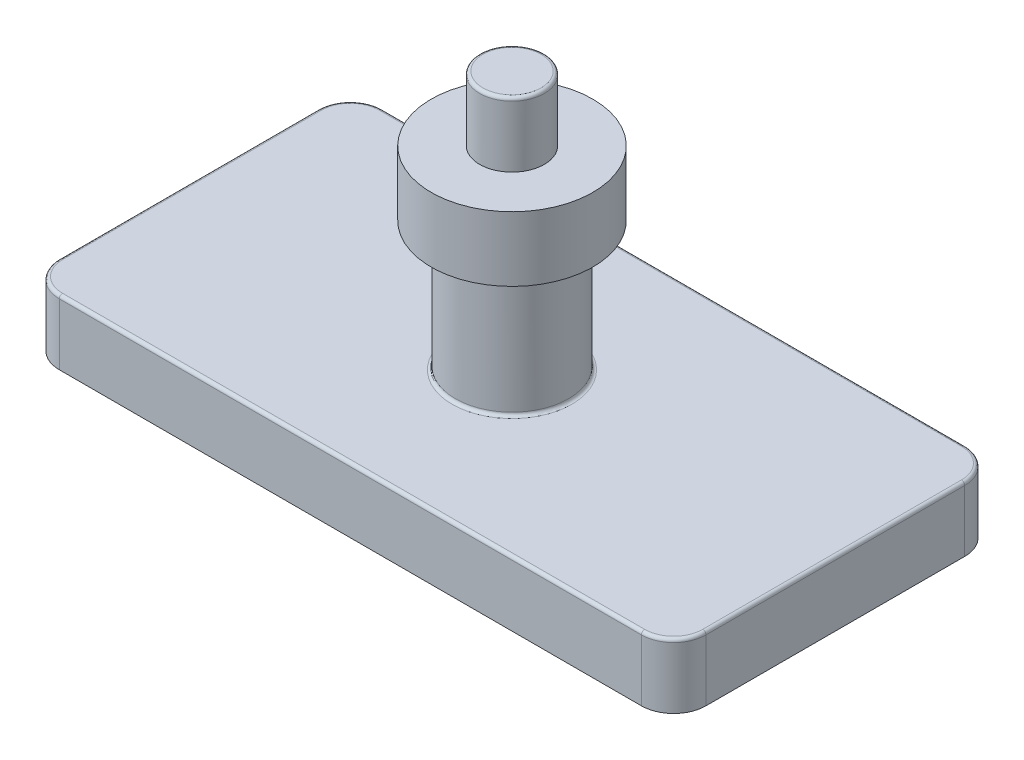
ISO-10303-21;
HEADER;
FILE_DESCRIPTION(('STEP AP214'),'2;1');
FILE_NAME('part.step','',(''),(''),'','','');
FILE_SCHEMA(('AUTOMOTIVE_DESIGN { 1 0 10303 214 1 1 1 1 }'));
ENDSEC;
DATA;
#1=APPLICATION_CONTEXT('core data for automotive mechanical design processes');
#2=APPLICATION_PROTOCOL_DEFINITION('international standard','automotive_design',2000,#1);
#3=PRODUCT_CONTEXT('',#1,'mechanical');
#4=PRODUCT('Part','Part','',(#3));
#5=PRODUCT_RELATED_PRODUCT_CATEGORY('part','',(#4));
#6=PRODUCT_DEFINITION_FORMATION('','',#4);
#7=PRODUCT_DEFINITION_CONTEXT('part definition',#1,'design');
#8=PRODUCT_DEFINITION('design','',#6,#7);
#9=PRODUCT_DEFINITION_SHAPE('','',#8);
#10=(LENGTH_UNIT() NAMED_UNIT(*) SI_UNIT(.MILLI.,.METRE.));
#11=(NAMED_UNIT(*) PLANE_ANGLE_UNIT() SI_UNIT($,.RADIAN.));
#12=(NAMED_UNIT(*) SI_UNIT($,.STERADIAN.) SOLID_ANGLE_UNIT());
#13=UNCERTAINTY_MEASURE_WITH_UNIT(LENGTH_MEASURE(1.E-05),#10,'distance_accuracy_value','');
#14=(GEOMETRIC_REPRESENTATION_CONTEXT(3) GLOBAL_UNCERTAINTY_ASSIGNED_CONTEXT((#13)) GLOBAL_UNIT_ASSIGNED_CONTEXT((#10,
#11,#12)) REPRESENTATION_CONTEXT('',''));
#15=CARTESIAN_POINT('',(0.,0.,0.));
#16=DIRECTION('',(0.,0.,1.));
#17=DIRECTION('',(1.,0.,0.));
#18=AXIS2_PLACEMENT_3D('',#15,#16,#17);
#19=CARTESIAN_POINT('',(-127.,25.4,-63.5));
#20=DIRECTION('',(1.,0.,0.));
#21=DIRECTION('',(0.,0.,-1.));
#22=AXIS2_PLACEMENT_3D('',#19,#20,#21);
#23=PLANE('',#22);
#24=DIRECTION('',(0.,-1.,0.));
#25=VECTOR('',#24,1.);
#26=CARTESIAN_POINT('',(-127.,25.4,50.8));
#27=LINE('',#26,#25);
#28=CARTESIAN_POINT('',(-127.,0.,50.8));
#29=VERTEX_POINT('',#28);
#30=CARTESIAN_POINT('',(-127.,24.13,50.8));
#31=VERTEX_POINT('',#30);
#32=EDGE_CURVE('E165',#29,#31,#27,.F.);
#33=ORIENTED_EDGE('',*,*,#32,.T.);
#34=DIRECTION('',(0.,0.,1.));
#35=VECTOR('',#34,1.);
#36=CARTESIAN_POINT('',(-127.,24.13,-50.8));
#37=LINE('',#36,#35);
#38=CARTESIAN_POINT('',(-127.,24.13,-50.8));
#39=VERTEX_POINT('',#38);
#40=EDGE_CURVE('E193',#31,#39,#37,.F.);
#41=ORIENTED_EDGE('',*,*,#40,.T.);
#42=DIRECTION('',(0.,-1.,0.));
#43=VECTOR('',#42,1.);
#44=CARTESIAN_POINT('',(-127.,25.4,-50.8));
#45=LINE('',#44,#43);
#46=CARTESIAN_POINT('',(-127.,0.,-50.8));
#47=VERTEX_POINT('',#46);
#48=EDGE_CURVE('E168',#39,#47,#45,.T.);
#49=ORIENTED_EDGE('',*,*,#48,.T.);
#50=DIRECTION('',(0.,0.,1.));
#51=VECTOR('',#50,1.);
#52=CARTESIAN_POINT('',(-127.,0.,-63.5));
#53=LINE('',#52,#51);
#54=EDGE_CURVE('E149',#47,#29,#53,.T.);
#55=ORIENTED_EDGE('',*,*,#54,.T.);
#56=EDGE_LOOP('',(#33,#41,#49,#55));
#57=FACE_BOUND('',#56,.T.);
#58=ADVANCED_FACE('F34',(#57),#23,.F.);
#59=CARTESIAN_POINT('',(-127.,25.4,63.5));
#60=DIRECTION('',(0.,0.,-1.));
#61=DIRECTION('',(-1.,0.,0.));
#62=AXIS2_PLACEMENT_3D('',#59,#60,#61);
#63=PLANE('',#62);
#64=DIRECTION('',(0.,-1.,0.));
#65=VECTOR('',#64,1.);
#66=CARTESIAN_POINT('',(114.3,25.4,63.5));
#67=LINE('',#66,#65);
#68=CARTESIAN_POINT('',(114.3,0.,63.5));
#69=VERTEX_POINT('',#68);
#70=CARTESIAN_POINT('',(114.3,24.13,63.5));
#71=VERTEX_POINT('',#70);
#72=EDGE_CURVE('E134',#69,#71,#67,.F.);
#73=ORIENTED_EDGE('',*,*,#72,.T.);
#74=DIRECTION('',(1.,0.,0.));
#75=VECTOR('',#74,1.);
#76=CARTESIAN_POINT('',(-114.3,24.13,63.5));
#77=LINE('',#76,#75);
#78=CARTESIAN_POINT('',(-114.3,24.13,63.5));
#79=VERTEX_POINT('',#78);
#80=EDGE_CURVE('E206',#71,#79,#77,.F.);
#81=ORIENTED_EDGE('',*,*,#80,.T.);
#82=DIRECTION('',(0.,-1.,0.));
#83=VECTOR('',#82,1.);
#84=CARTESIAN_POINT('',(-114.3,25.4,63.5));
#85=LINE('',#84,#83);
#86=CARTESIAN_POINT('',(-114.3,0.,63.5));
#87=VERTEX_POINT('',#86);
#88=EDGE_CURVE('E138',#79,#87,#85,.T.);
#89=ORIENTED_EDGE('',*,*,#88,.T.);
#90=DIRECTION('',(1.,0.,0.));
#91=VECTOR('',#90,1.);
#92=CARTESIAN_POINT('',(-127.,0.,63.5));
#93=LINE('',#92,#91);
#94=EDGE_CURVE('E145',#87,#69,#93,.T.);
#95=ORIENTED_EDGE('',*,*,#94,.T.);
#96=EDGE_LOOP('',(#73,#81,#89,#95));
#97=FACE_BOUND('',#96,.T.);
#98=ADVANCED_FACE('F226',(#97),#63,.F.);
#99=CARTESIAN_POINT('',(127.,25.4,-63.5));
#100=DIRECTION('',(-1.,0.,0.));
#101=DIRECTION('',(0.,0.,1.));
#102=AXIS2_PLACEMENT_3D('',#99,#100,#101);
#103=PLANE('',#102);
#104=DIRECTION('',(0.,-1.,0.));
#105=VECTOR('',#104,1.);
#106=CARTESIAN_POINT('',(127.,25.4,-50.8));
#107=LINE('',#106,#105);
#108=CARTESIAN_POINT('',(127.,0.,-50.8));
#109=VERTEX_POINT('',#108);
#110=CARTESIAN_POINT('',(127.,24.13,-50.8));
#111=VERTEX_POINT('',#110);
#112=EDGE_CURVE('E130',#109,#111,#107,.F.);
#113=ORIENTED_EDGE('',*,*,#112,.T.);
#114=DIRECTION('',(0.,0.,-1.));
#115=VECTOR('',#114,1.);
#116=CARTESIAN_POINT('',(127.,24.13,50.8));
#117=LINE('',#116,#115);
#118=CARTESIAN_POINT('',(127.,24.13,50.8));
#119=VERTEX_POINT('',#118);
#120=EDGE_CURVE('E56',#111,#119,#117,.F.);
#121=ORIENTED_EDGE('',*,*,#120,.T.);
#122=DIRECTION('',(0.,-1.,0.));
#123=VECTOR('',#122,1.);
#124=CARTESIAN_POINT('',(127.,25.4,50.8));
#125=LINE('',#124,#123);
#126=CARTESIAN_POINT('',(127.,0.,50.8));
#127=VERTEX_POINT('',#126);
#128=EDGE_CURVE('E122',#119,#127,#125,.T.);
#129=ORIENTED_EDGE('',*,*,#128,.T.);
#130=DIRECTION('',(0.,0.,-1.));
#131=VECTOR('',#130,1.);
#132=CARTESIAN_POINT('',(127.,0.,-63.5));
#133=LINE('',#132,#131);
#134=EDGE_CURVE('E126',#127,#109,#133,.T.);
#135=ORIENTED_EDGE('',*,*,#134,.T.);
#136=EDGE_LOOP('',(#113,#121,#129,#135));
#137=FACE_BOUND('',#136,.T.);
#138=ADVANCED_FACE('F124',(#137),#103,.F.);
#139=CARTESIAN_POINT('',(-127.,25.4,-63.5));
#140=DIRECTION('',(0.,0.,1.));
#141=DIRECTION('',(1.,0.,0.));
#142=AXIS2_PLACEMENT_3D('',#139,#140,#141);
#143=PLANE('',#142);
#144=DIRECTION('',(0.,-1.,0.));
#145=VECTOR('',#144,1.);
#146=CARTESIAN_POINT('',(-114.3,25.4,-63.5));
#147=LINE('',#146,#145);
#148=CARTESIAN_POINT('',(-114.3,0.,-63.5));
#149=VERTEX_POINT('',#148);
#150=CARTESIAN_POINT('',(-114.3,24.13,-63.5));
#151=VERTEX_POINT('',#150);
#152=EDGE_CURVE('E160',#149,#151,#147,.F.);
#153=ORIENTED_EDGE('',*,*,#152,.T.);
#154=DIRECTION('',(-1.,0.,0.));
#155=VECTOR('',#154,1.);
#156=CARTESIAN_POINT('',(114.3,24.13,-63.5));
#157=LINE('',#156,#155);
#158=CARTESIAN_POINT('',(114.3,24.13,-63.5));
#159=VERTEX_POINT('',#158);
#160=EDGE_CURVE('E197',#151,#159,#157,.F.);
#161=ORIENTED_EDGE('',*,*,#160,.T.);
#162=DIRECTION('',(0.,-1.,0.));
#163=VECTOR('',#162,1.);
#164=CARTESIAN_POINT('',(114.3,25.4,-63.5));
#165=LINE('',#164,#163);
#166=CARTESIAN_POINT('',(114.3,0.,-63.5));
#167=VERTEX_POINT('',#166);
#168=EDGE_CURVE('E163',#159,#167,#165,.T.);
#169=ORIENTED_EDGE('',*,*,#168,.T.);
#170=DIRECTION('',(-1.,0.,0.));
#171=VECTOR('',#170,1.);
#172=CARTESIAN_POINT('',(-127.,0.,-63.5));
#173=LINE('',#172,#171);
#174=EDGE_CURVE('E144',#167,#149,#173,.T.);
#175=ORIENTED_EDGE('',*,*,#174,.T.);
#176=EDGE_LOOP('',(#153,#161,#169,#175));
#177=FACE_BOUND('',#176,.T.);
#178=ADVANCED_FACE('F306',(#177),#143,.F.);
#179=CARTESIAN_POINT('',(-127.,25.4,63.5));
#180=DIRECTION('',(0.,1.,0.));
#181=DIRECTION('',(0.,0.,1.));
#182=AXIS2_PLACEMENT_3D('',#179,#180,#181);
#183=PLANE('',#182);
#184=CARTESIAN_POINT('',(0.,25.4,0.));
#185=DIRECTION('',(0.,1.,0.));
#186=DIRECTION('',(0.,0.,1.));
#187=AXIS2_PLACEMENT_3D('',#184,#185,#186);
#188=CIRCLE('',#187,23.495);
#189=CARTESIAN_POINT('',(0.,25.4,23.495));
#190=VERTEX_POINT('',#189);
#191=EDGE_CURVE('E187',#190,#190,#188,.F.);
#192=ORIENTED_EDGE('',*,*,#191,.T.);
#193=EDGE_LOOP('',(#192));
#194=FACE_BOUND('',#193,.T.);
#195=DIRECTION('',(0.,0.,1.));
#196=VECTOR('',#195,1.);
#197=CARTESIAN_POINT('',(-125.73,25.4,50.8));
#198=LINE('',#197,#196);
#199=CARTESIAN_POINT('',(-125.73,25.4,-50.8));
#200=VERTEX_POINT('',#199);
#201=CARTESIAN_POINT('',(-125.73,25.4,50.8));
#202=VERTEX_POINT('',#201);
#203=EDGE_CURVE('E182',#200,#202,#198,.T.);
#204=ORIENTED_EDGE('',*,*,#203,.T.);
#205=CARTESIAN_POINT('',(-114.3,25.4,50.8));
#206=DIRECTION('',(0.,1.,0.));
#207=DIRECTION('',(0.,0.,1.));
#208=AXIS2_PLACEMENT_3D('',#205,#206,#207);
#209=CIRCLE('',#208,11.43);
#210=CARTESIAN_POINT('',(-114.3,25.4,62.23));
#211=VERTEX_POINT('',#210);
#212=EDGE_CURVE('E184',#202,#211,#209,.T.);
#213=ORIENTED_EDGE('',*,*,#212,.T.);
#214=DIRECTION('',(1.,0.,0.));
#215=VECTOR('',#214,1.);
#216=CARTESIAN_POINT('',(114.3,25.4,62.23));
#217=LINE('',#216,#215);
#218=CARTESIAN_POINT('',(114.3,25.4,62.23));
#219=VERTEX_POINT('',#218);
#220=EDGE_CURVE('E170',#211,#219,#217,.T.);
#221=ORIENTED_EDGE('',*,*,#220,.T.);
#222=CARTESIAN_POINT('',(114.3,25.4,50.8));
#223=DIRECTION('',(0.,1.,0.));
#224=DIRECTION('',(0.,0.,1.));
#225=AXIS2_PLACEMENT_3D('',#222,#223,#224);
#226=CIRCLE('',#225,11.43);
#227=CARTESIAN_POINT('',(125.73,25.4,50.8));
#228=VERTEX_POINT('',#227);
#229=EDGE_CURVE('E172',#219,#228,#226,.T.);
#230=ORIENTED_EDGE('',*,*,#229,.T.);
#231=DIRECTION('',(0.,0.,-1.));
#232=VECTOR('',#231,1.);
#233=CARTESIAN_POINT('',(125.73,25.4,-50.8));
#234=LINE('',#233,#232);
#235=CARTESIAN_POINT('',(125.73,25.4,-50.8));
#236=VERTEX_POINT('',#235);
#237=EDGE_CURVE('E174',#228,#236,#234,.T.);
#238=ORIENTED_EDGE('',*,*,#237,.T.);
#239=CARTESIAN_POINT('',(114.3,25.4,-50.8));
#240=DIRECTION('',(0.,1.,0.));
#241=DIRECTION('',(0.,0.,1.));
#242=AXIS2_PLACEMENT_3D('',#239,#240,#241);
#243=CIRCLE('',#242,11.43);
#244=CARTESIAN_POINT('',(114.3,25.4,-62.23));
#245=VERTEX_POINT('',#244);
#246=EDGE_CURVE('E176',#236,#245,#243,.T.);
#247=ORIENTED_EDGE('',*,*,#246,.T.);
#248=DIRECTION('',(-1.,0.,0.));
#249=VECTOR('',#248,1.);
#250=CARTESIAN_POINT('',(-114.3,25.4,-62.23));
#251=LINE('',#250,#249);
#252=CARTESIAN_POINT('',(-114.3,25.4,-62.23));
#253=VERTEX_POINT('',#252);
#254=EDGE_CURVE('E178',#245,#253,#251,.T.);
#255=ORIENTED_EDGE('',*,*,#254,.T.);
#256=CARTESIAN_POINT('',(-114.3,25.4,-50.8));
#257=DIRECTION('',(0.,1.,0.));
#258=DIRECTION('',(0.,0.,1.));
#259=AXIS2_PLACEMENT_3D('',#256,#257,#258);
#260=CIRCLE('',#259,11.43);
#261=EDGE_CURVE('E180',#253,#200,#260,.T.);
#262=ORIENTED_EDGE('',*,*,#261,.T.);
#263=EDGE_LOOP('',(#204,#213,#221,#230,#238,#247,#255,#262));
#264=FACE_BOUND('',#263,.T.);
#265=ADVANCED_FACE('F303',(#194,#264),#183,.T.);
#266=CARTESIAN_POINT('',(-127.,0.,63.5));
#267=DIRECTION('',(0.,1.,0.));
#268=DIRECTION('',(0.,0.,1.));
#269=AXIS2_PLACEMENT_3D('',#266,#267,#268);
#270=PLANE('',#269);
#271=ORIENTED_EDGE('',*,*,#134,.F.);
#272=CARTESIAN_POINT('',(114.3,0.,50.8));
#273=DIRECTION('',(0.,1.,0.));
#274=DIRECTION('',(0.,0.,1.));
#275=AXIS2_PLACEMENT_3D('',#272,#273,#274);
#276=CIRCLE('',#275,12.7);
#277=EDGE_CURVE('E132',#127,#69,#276,.F.);
#278=ORIENTED_EDGE('',*,*,#277,.T.);
#279=ORIENTED_EDGE('',*,*,#94,.F.);
#280=CARTESIAN_POINT('',(-114.3,0.,50.8));
#281=DIRECTION('',(0.,1.,0.));
#282=DIRECTION('',(0.,0.,1.));
#283=AXIS2_PLACEMENT_3D('',#280,#281,#282);
#284=CIRCLE('',#283,12.7);
#285=EDGE_CURVE('E129',#87,#29,#284,.F.);
#286=ORIENTED_EDGE('',*,*,#285,.T.);
#287=ORIENTED_EDGE('',*,*,#54,.F.);
#288=CARTESIAN_POINT('',(-114.3,0.,-50.8));
#289=DIRECTION('',(0.,1.,0.));
#290=DIRECTION('',(0.,0.,1.));
#291=AXIS2_PLACEMENT_3D('',#288,#289,#290);
#292=CIRCLE('',#291,12.7);
#293=EDGE_CURVE('E155',#47,#149,#292,.F.);
#294=ORIENTED_EDGE('',*,*,#293,.T.);
#295=ORIENTED_EDGE('',*,*,#174,.F.);
#296=CARTESIAN_POINT('',(114.3,0.,-50.8));
#297=DIRECTION('',(0.,1.,0.));
#298=DIRECTION('',(0.,0.,1.));
#299=AXIS2_PLACEMENT_3D('',#296,#297,#298);
#300=CIRCLE('',#299,12.7);
#301=EDGE_CURVE('E139',#167,#109,#300,.F.);
#302=ORIENTED_EDGE('',*,*,#301,.T.);
#303=EDGE_LOOP('',(#271,#278,#279,#286,#287,#294,#295,#302));
#304=FACE_BOUND('',#303,.T.);
#305=ADVANCED_FACE('F141',(#304),#270,.F.);
#306=CARTESIAN_POINT('',(0.,127.,0.));
#307=DIRECTION('',(0.,1.,0.));
#308=DIRECTION('',(0.,0.,1.));
#309=AXIS2_PLACEMENT_3D('',#306,#307,#308);
#310=PLANE('',#309);
#311=CARTESIAN_POINT('',(0.,127.,0.));
#312=DIRECTION('',(0.,1.,0.));
#313=DIRECTION('',(0.,0.,1.));
#314=AXIS2_PLACEMENT_3D('',#311,#312,#313);
#315=CIRCLE('',#314,11.43);
#316=CARTESIAN_POINT('',(0.,127.,11.43));
#317=VERTEX_POINT('',#316);
#318=EDGE_CURVE('E11',#317,#317,#315,.T.);
#319=ORIENTED_EDGE('',*,*,#318,.T.);
#320=EDGE_LOOP('',(#319));
#321=FACE_BOUND('',#320,.T.);
#322=ADVANCED_FACE('F289',(#321),#310,.T.);
#323=CARTESIAN_POINT('',(0.,0.,0.));
#324=DIRECTION('',(0.,-1.,0.));
#325=DIRECTION('',(0.,0.,-1.));
#326=AXIS2_PLACEMENT_3D('',#323,#324,#325);
#327=CYLINDRICAL_SURFACE('',#326,12.7);
#328=CARTESIAN_POINT('',(0.,125.73,0.));
#329=DIRECTION('',(0.,1.,0.));
#330=DIRECTION('',(0.,0.,1.));
#331=AXIS2_PLACEMENT_3D('',#328,#329,#330);
#332=CIRCLE('',#331,12.7);
#333=CARTESIAN_POINT('',(0.,125.73,12.7));
#334=VERTEX_POINT('',#333);
#335=EDGE_CURVE('E41',#334,#334,#332,.F.);
#336=ORIENTED_EDGE('',*,*,#335,.T.);
#337=EDGE_LOOP('',(#336));
#338=FACE_BOUND('',#337,.T.);
#339=CARTESIAN_POINT('',(0.,101.6,0.));
#340=DIRECTION('',(0.,-1.,0.));
#341=DIRECTION('',(0.,0.,-1.));
#342=AXIS2_PLACEMENT_3D('',#339,#340,#341);
#343=CIRCLE('',#342,12.7);
#344=CARTESIAN_POINT('',(0.,101.6,-12.7));
#345=VERTEX_POINT('',#344);
#346=EDGE_CURVE('E282',#345,#345,#343,.T.);
#347=ORIENTED_EDGE('',*,*,#346,.F.);
#348=EDGE_LOOP('',(#347));
#349=FACE_BOUND('',#348,.T.);
#350=ADVANCED_FACE('F210',(#338,#349),#327,.T.);
#351=CARTESIAN_POINT('',(12.7,101.6,0.));
#352=DIRECTION('',(0.,1.,0.));
#353=DIRECTION('',(0.,0.,1.));
#354=AXIS2_PLACEMENT_3D('',#351,#352,#353);
#355=PLANE('',#354);
#356=ORIENTED_EDGE('',*,*,#346,.T.);
#357=EDGE_LOOP('',(#356));
#358=FACE_BOUND('',#357,.T.);
#359=CARTESIAN_POINT('',(0.,101.6,0.));
#360=DIRECTION('',(0.,-1.,0.));
#361=DIRECTION('',(0.,0.,-1.));
#362=AXIS2_PLACEMENT_3D('',#359,#360,#361);
#363=CIRCLE('',#362,31.75);
#364=CARTESIAN_POINT('',(0.,101.6,-31.75));
#365=VERTEX_POINT('',#364);
#366=EDGE_CURVE('E279',#365,#365,#363,.T.);
#367=ORIENTED_EDGE('',*,*,#366,.F.);
#368=EDGE_LOOP('',(#367));
#369=FACE_BOUND('',#368,.T.);
#370=ADVANCED_FACE('F286',(#358,#369),#355,.T.);
#371=CARTESIAN_POINT('',(0.,0.,0.));
#372=DIRECTION('',(0.,-1.,0.));
#373=DIRECTION('',(0.,0.,-1.));
#374=AXIS2_PLACEMENT_3D('',#371,#372,#373);
#375=CYLINDRICAL_SURFACE('',#374,31.75);
#376=ORIENTED_EDGE('',*,*,#366,.T.);
#377=EDGE_LOOP('',(#376));
#378=FACE_BOUND('',#377,.T.);
#379=CARTESIAN_POINT('',(0.,76.2,0.));
#380=DIRECTION('',(0.,-1.,0.));
#381=DIRECTION('',(0.,0.,-1.));
#382=AXIS2_PLACEMENT_3D('',#379,#380,#381);
#383=CIRCLE('',#382,31.75);
#384=CARTESIAN_POINT('',(0.,76.2,-31.75));
#385=VERTEX_POINT('',#384);
#386=EDGE_CURVE('E276',#385,#385,#383,.T.);
#387=ORIENTED_EDGE('',*,*,#386,.F.);
#388=EDGE_LOOP('',(#387));
#389=FACE_BOUND('',#388,.T.);
#390=ADVANCED_FACE('F295',(#378,#389),#375,.T.);
#391=CARTESIAN_POINT('',(31.75,76.2,0.));
#392=DIRECTION('',(0.,-1.,0.));
#393=DIRECTION('',(0.,0.,-1.));
#394=AXIS2_PLACEMENT_3D('',#391,#392,#393);
#395=PLANE('',#394);
#396=ORIENTED_EDGE('',*,*,#386,.T.);
#397=EDGE_LOOP('',(#396));
#398=FACE_BOUND('',#397,.T.);
#399=CARTESIAN_POINT('',(0.,76.2,0.));
#400=DIRECTION('',(0.,-1.,0.));
#401=DIRECTION('',(0.,0.,-1.));
#402=AXIS2_PLACEMENT_3D('',#399,#400,#401);
#403=CIRCLE('',#402,22.225);
#404=CARTESIAN_POINT('',(0.,76.2,-22.225));
#405=VERTEX_POINT('',#404);
#406=EDGE_CURVE('E273',#405,#405,#403,.T.);
#407=ORIENTED_EDGE('',*,*,#406,.F.);
#408=EDGE_LOOP('',(#407));
#409=FACE_BOUND('',#408,.T.);
#410=ADVANCED_FACE('F348',(#398,#409),#395,.T.);
#411=CARTESIAN_POINT('',(0.,0.,0.));
#412=DIRECTION('',(0.,-1.,0.));
#413=DIRECTION('',(0.,0.,-1.));
#414=AXIS2_PLACEMENT_3D('',#411,#412,#413);
#415=CYLINDRICAL_SURFACE('',#414,22.225);
#416=CARTESIAN_POINT('',(0.,26.67,0.));
#417=DIRECTION('',(0.,1.,0.));
#418=DIRECTION('',(0.,0.,1.));
#419=AXIS2_PLACEMENT_3D('',#416,#417,#418);
#420=CIRCLE('',#419,22.225);
#421=CARTESIAN_POINT('',(0.,26.67,22.225));
#422=VERTEX_POINT('',#421);
#423=EDGE_CURVE('E203',#422,#422,#420,.T.);
#424=ORIENTED_EDGE('',*,*,#423,.T.);
#425=EDGE_LOOP('',(#424));
#426=FACE_BOUND('',#425,.T.);
#427=ORIENTED_EDGE('',*,*,#406,.T.);
#428=EDGE_LOOP('',(#427));
#429=FACE_BOUND('',#428,.T.);
#430=ADVANCED_FACE('F343',(#426,#429),#415,.T.);
#431=CARTESIAN_POINT('',(114.3,25.4,50.8));
#432=DIRECTION('',(0.,-1.,0.));
#433=DIRECTION('',(0.,0.,-1.));
#434=AXIS2_PLACEMENT_3D('',#431,#432,#433);
#435=CYLINDRICAL_SURFACE('',#434,12.7);
#436=ORIENTED_EDGE('',*,*,#128,.F.);
#437=CARTESIAN_POINT('',(114.3,24.13,50.8));
#438=DIRECTION('',(0.,1.,0.));
#439=DIRECTION('',(0.,0.,1.));
#440=AXIS2_PLACEMENT_3D('',#437,#438,#439);
#441=CIRCLE('',#440,12.7);
#442=EDGE_CURVE('E48',#119,#71,#441,.F.);
#443=ORIENTED_EDGE('',*,*,#442,.T.);
#444=ORIENTED_EDGE('',*,*,#72,.F.);
#445=ORIENTED_EDGE('',*,*,#277,.F.);
#446=EDGE_LOOP('',(#436,#443,#444,#445));
#447=FACE_BOUND('',#446,.T.);
#448=ADVANCED_FACE('F133',(#447),#435,.T.);
#449=CARTESIAN_POINT('',(114.3,25.4,-50.8));
#450=DIRECTION('',(0.,-1.,0.));
#451=DIRECTION('',(0.,0.,-1.));
#452=AXIS2_PLACEMENT_3D('',#449,#450,#451);
#453=CYLINDRICAL_SURFACE('',#452,12.7);
#454=ORIENTED_EDGE('',*,*,#168,.F.);
#455=CARTESIAN_POINT('',(114.3,24.13,-50.8));
#456=DIRECTION('',(0.,1.,0.));
#457=DIRECTION('',(0.,0.,1.));
#458=AXIS2_PLACEMENT_3D('',#455,#456,#457);
#459=CIRCLE('',#458,12.7);
#460=EDGE_CURVE('E199',#159,#111,#459,.F.);
#461=ORIENTED_EDGE('',*,*,#460,.T.);
#462=ORIENTED_EDGE('',*,*,#112,.F.);
#463=ORIENTED_EDGE('',*,*,#301,.F.);
#464=EDGE_LOOP('',(#454,#461,#462,#463));
#465=FACE_BOUND('',#464,.T.);
#466=ADVANCED_FACE('F360',(#465),#453,.T.);
#467=CARTESIAN_POINT('',(-114.3,25.4,-50.8));
#468=DIRECTION('',(0.,-1.,0.));
#469=DIRECTION('',(0.,0.,-1.));
#470=AXIS2_PLACEMENT_3D('',#467,#468,#469);
#471=CYLINDRICAL_SURFACE('',#470,12.7);
#472=ORIENTED_EDGE('',*,*,#48,.F.);
#473=CARTESIAN_POINT('',(-114.3,24.13,-50.8));
#474=DIRECTION('',(0.,1.,0.));
#475=DIRECTION('',(0.,0.,1.));
#476=AXIS2_PLACEMENT_3D('',#473,#474,#475);
#477=CIRCLE('',#476,12.7);
#478=EDGE_CURVE('E195',#39,#151,#477,.F.);
#479=ORIENTED_EDGE('',*,*,#478,.T.);
#480=ORIENTED_EDGE('',*,*,#152,.F.);
#481=ORIENTED_EDGE('',*,*,#293,.F.);
#482=EDGE_LOOP('',(#472,#479,#480,#481));
#483=FACE_BOUND('',#482,.T.);
#484=ADVANCED_FACE('F369',(#483),#471,.T.);
#485=CARTESIAN_POINT('',(-114.3,25.4,50.8));
#486=DIRECTION('',(0.,-1.,0.));
#487=DIRECTION('',(0.,0.,-1.));
#488=AXIS2_PLACEMENT_3D('',#485,#486,#487);
#489=CYLINDRICAL_SURFACE('',#488,12.7);
#490=ORIENTED_EDGE('',*,*,#88,.F.);
#491=CARTESIAN_POINT('',(-114.3,24.13,50.8));
#492=DIRECTION('',(0.,1.,0.));
#493=DIRECTION('',(0.,0.,1.));
#494=AXIS2_PLACEMENT_3D('',#491,#492,#493);
#495=CIRCLE('',#494,12.7);
#496=EDGE_CURVE('E190',#79,#31,#495,.F.);
#497=ORIENTED_EDGE('',*,*,#496,.T.);
#498=ORIENTED_EDGE('',*,*,#32,.F.);
#499=ORIENTED_EDGE('',*,*,#285,.F.);
#500=EDGE_LOOP('',(#490,#497,#498,#499));
#501=FACE_BOUND('',#500,.T.);
#502=ADVANCED_FACE('F240',(#501),#489,.T.);
#503=CARTESIAN_POINT('',(114.3,24.13,-50.8));
#504=DIRECTION('',(0.,1.,0.));
#505=DIRECTION('',(0.,0.,1.));
#506=AXIS2_PLACEMENT_3D('',#503,#504,#505);
#507=TOROIDAL_SURFACE('',#506,11.43,1.27);
#508=CARTESIAN_POINT('',(125.73,24.13,-50.8));
#509=DIRECTION('',(0.,0.,1.));
#510=DIRECTION('',(1.,0.,0.));
#511=AXIS2_PLACEMENT_3D('',#508,#509,#510);
#512=CIRCLE('',#511,1.27);
#513=EDGE_CURVE('E267',#111,#236,#512,.T.);
#514=ORIENTED_EDGE('',*,*,#513,.F.);
#515=ORIENTED_EDGE('',*,*,#460,.F.);
#516=CARTESIAN_POINT('',(114.3,24.13,-62.23));
#517=DIRECTION('',(-1.,0.,0.));
#518=DIRECTION('',(0.,0.,1.));
#519=AXIS2_PLACEMENT_3D('',#516,#517,#518);
#520=CIRCLE('',#519,1.27);
#521=EDGE_CURVE('E270',#245,#159,#520,.T.);
#522=ORIENTED_EDGE('',*,*,#521,.F.);
#523=ORIENTED_EDGE('',*,*,#246,.F.);
#524=EDGE_LOOP('',(#514,#515,#522,#523));
#525=FACE_BOUND('',#524,.T.);
#526=ADVANCED_FACE('F388',(#525),#507,.T.);
#527=CARTESIAN_POINT('',(-127.,24.13,-62.23));
#528=DIRECTION('',(1.,0.,0.));
#529=DIRECTION('',(0.,0.,-1.));
#530=AXIS2_PLACEMENT_3D('',#527,#528,#529);
#531=CYLINDRICAL_SURFACE('',#530,1.27);
#532=ORIENTED_EDGE('',*,*,#521,.T.);
#533=ORIENTED_EDGE('',*,*,#160,.F.);
#534=CARTESIAN_POINT('',(-114.3,24.13,-62.23));
#535=DIRECTION('',(-1.,0.,0.));
#536=DIRECTION('',(0.,0.,1.));
#537=AXIS2_PLACEMENT_3D('',#534,#535,#536);
#538=CIRCLE('',#537,1.27);
#539=EDGE_CURVE('E264',#253,#151,#538,.T.);
#540=ORIENTED_EDGE('',*,*,#539,.F.);
#541=ORIENTED_EDGE('',*,*,#254,.F.);
#542=EDGE_LOOP('',(#532,#533,#540,#541));
#543=FACE_BOUND('',#542,.T.);
#544=ADVANCED_FACE('F397',(#543),#531,.T.);
#545=CARTESIAN_POINT('',(125.73,24.13,63.4999999999999));
#546=DIRECTION('',(0.,0.,1.));
#547=DIRECTION('',(1.,0.,0.));
#548=AXIS2_PLACEMENT_3D('',#545,#546,#547);
#549=CYLINDRICAL_SURFACE('',#548,1.27);
#550=ORIENTED_EDGE('',*,*,#513,.T.);
#551=ORIENTED_EDGE('',*,*,#237,.F.);
#552=CARTESIAN_POINT('',(125.73,24.13,50.8));
#553=DIRECTION('',(0.,0.,1.));
#554=DIRECTION('',(1.,0.,0.));
#555=AXIS2_PLACEMENT_3D('',#552,#553,#554);
#556=CIRCLE('',#555,1.27);
#557=EDGE_CURVE('E261',#119,#228,#556,.T.);
#558=ORIENTED_EDGE('',*,*,#557,.F.);
#559=ORIENTED_EDGE('',*,*,#120,.F.);
#560=EDGE_LOOP('',(#550,#551,#558,#559));
#561=FACE_BOUND('',#560,.T.);
#562=ADVANCED_FACE('F407',(#561),#549,.T.);
#563=CARTESIAN_POINT('',(-114.3,24.13,-50.8));
#564=DIRECTION('',(0.,1.,0.));
#565=DIRECTION('',(0.,0.,1.));
#566=AXIS2_PLACEMENT_3D('',#563,#564,#565);
#567=TOROIDAL_SURFACE('',#566,11.43,1.27);
#568=ORIENTED_EDGE('',*,*,#539,.T.);
#569=ORIENTED_EDGE('',*,*,#478,.F.);
#570=CARTESIAN_POINT('',(-125.73,24.13,-50.8));
#571=DIRECTION('',(0.,0.,1.));
#572=DIRECTION('',(1.,0.,0.));
#573=AXIS2_PLACEMENT_3D('',#570,#571,#572);
#574=CIRCLE('',#573,1.27);
#575=EDGE_CURVE('E258',#200,#39,#574,.T.);
#576=ORIENTED_EDGE('',*,*,#575,.F.);
#577=ORIENTED_EDGE('',*,*,#261,.F.);
#578=EDGE_LOOP('',(#568,#569,#576,#577));
#579=FACE_BOUND('',#578,.T.);
#580=ADVANCED_FACE('F417',(#579),#567,.T.);
#581=CARTESIAN_POINT('',(114.3,24.13,50.8));
#582=DIRECTION('',(0.,1.,0.));
#583=DIRECTION('',(0.,0.,1.));
#584=AXIS2_PLACEMENT_3D('',#581,#582,#583);
#585=TOROIDAL_SURFACE('',#584,11.43,1.27);
#586=ORIENTED_EDGE('',*,*,#557,.T.);
#587=ORIENTED_EDGE('',*,*,#229,.F.);
#588=CARTESIAN_POINT('',(114.3,24.13,62.23));
#589=DIRECTION('',(-1.,0.,0.));
#590=DIRECTION('',(0.,0.,1.));
#591=AXIS2_PLACEMENT_3D('',#588,#589,#590);
#592=CIRCLE('',#591,1.27);
#593=EDGE_CURVE('E254',#71,#219,#592,.T.);
#594=ORIENTED_EDGE('',*,*,#593,.F.);
#595=ORIENTED_EDGE('',*,*,#442,.F.);
#596=EDGE_LOOP('',(#586,#587,#594,#595));
#597=FACE_BOUND('',#596,.T.);
#598=ADVANCED_FACE('F427',(#597),#585,.T.);
#599=CARTESIAN_POINT('',(-125.73,24.13,63.5));
#600=DIRECTION('',(0.,0.,-1.));
#601=DIRECTION('',(-1.,0.,0.));
#602=AXIS2_PLACEMENT_3D('',#599,#600,#601);
#603=CYLINDRICAL_SURFACE('',#602,1.27);
#604=ORIENTED_EDGE('',*,*,#575,.T.);
#605=ORIENTED_EDGE('',*,*,#40,.F.);
#606=CARTESIAN_POINT('',(-125.73,24.13,50.8));
#607=DIRECTION('',(0.,0.,1.));
#608=DIRECTION('',(1.,0.,0.));
#609=AXIS2_PLACEMENT_3D('',#606,#607,#608);
#610=CIRCLE('',#609,1.27);
#611=EDGE_CURVE('E248',#202,#31,#610,.T.);
#612=ORIENTED_EDGE('',*,*,#611,.F.);
#613=ORIENTED_EDGE('',*,*,#203,.F.);
#614=EDGE_LOOP('',(#604,#605,#612,#613));
#615=FACE_BOUND('',#614,.T.);
#616=ADVANCED_FACE('F437',(#615),#603,.T.);
#617=CARTESIAN_POINT('',(-127.,24.13,62.23));
#618=DIRECTION('',(-1.,0.,0.));
#619=DIRECTION('',(0.,0.,1.));
#620=AXIS2_PLACEMENT_3D('',#617,#618,#619);
#621=CYLINDRICAL_SURFACE('',#620,1.27);
#622=ORIENTED_EDGE('',*,*,#593,.T.);
#623=ORIENTED_EDGE('',*,*,#220,.F.);
#624=CARTESIAN_POINT('',(-114.3,24.13,62.23));
#625=DIRECTION('',(-1.,0.,0.));
#626=DIRECTION('',(0.,0.,1.));
#627=AXIS2_PLACEMENT_3D('',#624,#625,#626);
#628=CIRCLE('',#627,1.27);
#629=EDGE_CURVE('E245',#79,#211,#628,.T.);
#630=ORIENTED_EDGE('',*,*,#629,.F.);
#631=ORIENTED_EDGE('',*,*,#80,.F.);
#632=EDGE_LOOP('',(#622,#623,#630,#631));
#633=FACE_BOUND('',#632,.T.);
#634=ADVANCED_FACE('F252',(#633),#621,.T.);
#635=CARTESIAN_POINT('',(-114.3,24.13,50.8));
#636=DIRECTION('',(0.,1.,0.));
#637=DIRECTION('',(0.,0.,1.));
#638=AXIS2_PLACEMENT_3D('',#635,#636,#637);
#639=TOROIDAL_SURFACE('',#638,11.43,1.27);
#640=ORIENTED_EDGE('',*,*,#611,.T.);
#641=ORIENTED_EDGE('',*,*,#496,.F.);
#642=ORIENTED_EDGE('',*,*,#629,.T.);
#643=ORIENTED_EDGE('',*,*,#212,.F.);
#644=EDGE_LOOP('',(#640,#641,#642,#643));
#645=FACE_BOUND('',#644,.T.);
#646=ADVANCED_FACE('F221',(#645),#639,.T.);
#647=CARTESIAN_POINT('',(0.,26.67,0.));
#648=DIRECTION('',(0.,1.,0.));
#649=DIRECTION('',(0.,0.,1.));
#650=AXIS2_PLACEMENT_3D('',#647,#648,#649);
#651=TOROIDAL_SURFACE('',#650,23.495,1.27);
#652=ORIENTED_EDGE('',*,*,#191,.F.);
#653=EDGE_LOOP('',(#652));
#654=FACE_BOUND('',#653,.T.);
#655=ORIENTED_EDGE('',*,*,#423,.F.);
#656=EDGE_LOOP('',(#655));
#657=FACE_BOUND('',#656,.T.);
#658=ADVANCED_FACE('F215',(#654,#657),#651,.F.);
#659=CARTESIAN_POINT('',(0.,125.73,0.));
#660=DIRECTION('',(0.,1.,0.));
#661=DIRECTION('',(0.,0.,1.));
#662=AXIS2_PLACEMENT_3D('',#659,#660,#661);
#663=TOROIDAL_SURFACE('',#662,11.43,1.27);
#664=ORIENTED_EDGE('',*,*,#318,.F.);
#665=EDGE_LOOP('',(#664));
#666=FACE_BOUND('',#665,.T.);
#667=ORIENTED_EDGE('',*,*,#335,.F.);
#668=EDGE_LOOP('',(#667));
#669=FACE_BOUND('',#668,.T.);
#670=ADVANCED_FACE('F213',(#666,#669),#663,.T.);
#671=CLOSED_SHELL('',(#58,#98,#138,#178,#265,#305,#322,#350,#370,#390,#410,#430,#448,#466,#484,
#502,#526,#544,#562,#580,#598,#616,#634,#646,#658,#670));
#672=MANIFOLD_SOLID_BREP('B2',#671);
#673=ADVANCED_BREP_SHAPE_REPRESENTATION('',(#18,#672),#14);
#674=SHAPE_DEFINITION_REPRESENTATION(#9,#673);
ENDSEC;
END-ISO-10303-21;
